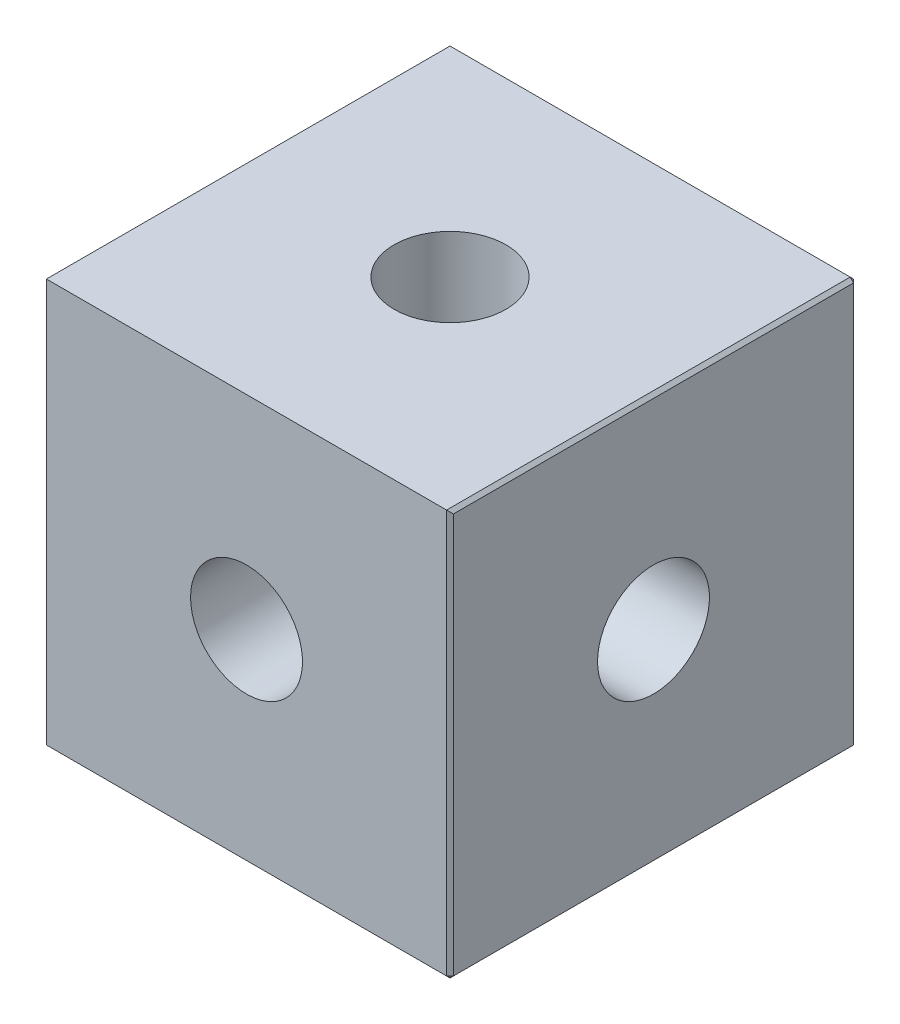
ISO-10303-21;
HEADER;
FILE_DESCRIPTION(('STEP AP214'),'2;1');
FILE_NAME('part.step','',(''),(''),'','','');
FILE_SCHEMA(('AUTOMOTIVE_DESIGN { 1 0 10303 214 1 1 1 1 }'));
ENDSEC;
DATA;
#1=APPLICATION_CONTEXT('core data for automotive mechanical design processes');
#2=APPLICATION_PROTOCOL_DEFINITION('international standard','automotive_design',2000,#1);
#3=PRODUCT_CONTEXT('',#1,'mechanical');
#4=PRODUCT('Part','Part','',(#3));
#5=PRODUCT_RELATED_PRODUCT_CATEGORY('part','',(#4));
#6=PRODUCT_DEFINITION_FORMATION('','',#4);
#7=PRODUCT_DEFINITION_CONTEXT('part definition',#1,'design');
#8=PRODUCT_DEFINITION('design','',#6,#7);
#9=PRODUCT_DEFINITION_SHAPE('','',#8);
#10=(LENGTH_UNIT() NAMED_UNIT(*) SI_UNIT(.MILLI.,.METRE.));
#11=(NAMED_UNIT(*) PLANE_ANGLE_UNIT() SI_UNIT($,.RADIAN.));
#12=(NAMED_UNIT(*) SI_UNIT($,.STERADIAN.) SOLID_ANGLE_UNIT());
#13=UNCERTAINTY_MEASURE_WITH_UNIT(LENGTH_MEASURE(1.E-05),#10,'distance_accuracy_value','');
#14=(GEOMETRIC_REPRESENTATION_CONTEXT(3) GLOBAL_UNCERTAINTY_ASSIGNED_CONTEXT((#13)) GLOBAL_UNIT_ASSIGNED_CONTEXT((#10,
#11,#12)) REPRESENTATION_CONTEXT('',''));
#15=CARTESIAN_POINT('',(0.,0.,0.));
#16=DIRECTION('',(0.,0.,1.));
#17=DIRECTION('',(1.,0.,0.));
#18=AXIS2_PLACEMENT_3D('',#15,#16,#17);
#19=CARTESIAN_POINT('',(-6.,12.,-6.));
#20=DIRECTION('',(0.,0.,1.));
#21=DIRECTION('',(1.,0.,0.));
#22=AXIS2_PLACEMENT_3D('',#19,#20,#21);
#23=PLANE('',#22);
#24=DIRECTION('',(0.,1.,0.));
#25=VECTOR('',#24,1.);
#26=CARTESIAN_POINT('',(-5.9,12.,-6.));
#27=LINE('',#26,#25);
#28=CARTESIAN_POINT('',(-5.9,0.0999999999999994,-6.));
#29=VERTEX_POINT('',#28);
#30=CARTESIAN_POINT('',(-5.9,11.9,-6.));
#31=VERTEX_POINT('',#30);
#32=EDGE_CURVE('E224',#29,#31,#27,.T.);
#33=ORIENTED_EDGE('',*,*,#32,.T.);
#34=DIRECTION('',(1.,0.,0.));
#35=VECTOR('',#34,1.);
#36=CARTESIAN_POINT('',(6.,11.9,-6.));
#37=LINE('',#36,#35);
#38=CARTESIAN_POINT('',(5.9,11.9,-6.));
#39=VERTEX_POINT('',#38);
#40=EDGE_CURVE('E230',#31,#39,#37,.T.);
#41=ORIENTED_EDGE('',*,*,#40,.T.);
#42=DIRECTION('',(0.,-1.,0.));
#43=VECTOR('',#42,1.);
#44=CARTESIAN_POINT('',(5.9,12.,-6.));
#45=LINE('',#44,#43);
#46=CARTESIAN_POINT('',(5.9,0.0999999999999994,-6.));
#47=VERTEX_POINT('',#46);
#48=EDGE_CURVE('E228',#39,#47,#45,.T.);
#49=ORIENTED_EDGE('',*,*,#48,.T.);
#50=DIRECTION('',(-1.,0.,0.));
#51=VECTOR('',#50,1.);
#52=CARTESIAN_POINT('',(-6.,0.0999999999999994,-6.));
#53=LINE('',#52,#51);
#54=EDGE_CURVE('E226',#47,#29,#53,.T.);
#55=ORIENTED_EDGE('',*,*,#54,.T.);
#56=EDGE_LOOP('',(#33,#41,#49,#55));
#57=FACE_BOUND('',#56,.T.);
#58=CARTESIAN_POINT('',(0.,6.,-6.));
#59=DIRECTION('',(0.,0.,-1.));
#60=DIRECTION('',(-1.,0.,0.));
#61=AXIS2_PLACEMENT_3D('',#58,#59,#60);
#62=CIRCLE('',#61,1.65);
#63=CARTESIAN_POINT('',(-1.65,6.,-6.));
#64=VERTEX_POINT('',#63);
#65=EDGE_CURVE('E327',#64,#64,#62,.T.);
#66=ORIENTED_EDGE('',*,*,#65,.F.);
#67=EDGE_LOOP('',(#66));
#68=FACE_BOUND('',#67,.T.);
#69=ADVANCED_FACE('F55',(#57,#68),#23,.F.);
#70=CARTESIAN_POINT('',(0.,12.,0.));
#71=DIRECTION('',(0.,1.,0.));
#72=DIRECTION('',(0.,0.,1.));
#73=AXIS2_PLACEMENT_3D('',#70,#71,#72);
#74=CYLINDRICAL_SURFACE('',#73,1.65);
#75=CARTESIAN_POINT('',(0.,12.,0.));
#76=DIRECTION('',(0.,1.,0.));
#77=DIRECTION('',(0.,0.,1.));
#78=AXIS2_PLACEMENT_3D('',#75,#76,#77);
#79=CIRCLE('',#78,1.65);
#80=CARTESIAN_POINT('',(0.,12.,1.65));
#81=VERTEX_POINT('',#80);
#82=EDGE_CURVE('E334',#81,#81,#79,.T.);
#83=ORIENTED_EDGE('',*,*,#82,.T.);
#84=EDGE_LOOP('',(#83));
#85=FACE_BOUND('',#84,.T.);
#86=CARTESIAN_POINT('',(0.,6.,0.));
#87=DIRECTION('',(0.,0.707106781186547,0.707106781186547));
#88=DIRECTION('',(0.,0.707106781186547,-0.707106781186547));
#89=AXIS2_PLACEMENT_3D('',#86,#87,#88);
#90=ELLIPSE('',#89,2.3334523779156,1.65);
#91=CARTESIAN_POINT('',(-1.1667261889578,7.1667261889578,-1.1667261889578));
#92=VERTEX_POINT('',#91);
#93=CARTESIAN_POINT('',(1.1667261889578,7.1667261889578,-1.1667261889578));
#94=VERTEX_POINT('',#93);
#95=EDGE_CURVE('E194',#92,#94,#90,.F.);
#96=ORIENTED_EDGE('',*,*,#95,.T.);
#97=CARTESIAN_POINT('',(0.,6.,0.));
#98=DIRECTION('',(-0.707106781186547,0.707106781186547,0.));
#99=DIRECTION('',(0.707106781186547,0.707106781186547,0.));
#100=AXIS2_PLACEMENT_3D('',#97,#98,#99);
#101=ELLIPSE('',#100,2.3334523779156,1.65);
#102=CARTESIAN_POINT('',(1.1667261889578,7.1667261889578,1.1667261889578));
#103=VERTEX_POINT('',#102);
#104=EDGE_CURVE('E316',#94,#103,#101,.F.);
#105=ORIENTED_EDGE('',*,*,#104,.T.);
#106=CARTESIAN_POINT('',(0.,6.,0.));
#107=DIRECTION('',(0.,0.707106781186547,-0.707106781186547));
#108=DIRECTION('',(0.,0.707106781186547,0.707106781186547));
#109=AXIS2_PLACEMENT_3D('',#106,#107,#108);
#110=ELLIPSE('',#109,2.3334523779156,1.65);
#111=CARTESIAN_POINT('',(-1.1667261889578,7.1667261889578,1.1667261889578));
#112=VERTEX_POINT('',#111);
#113=EDGE_CURVE('E178',#103,#112,#110,.F.);
#114=ORIENTED_EDGE('',*,*,#113,.T.);
#115=CARTESIAN_POINT('',(0.,6.,0.));
#116=DIRECTION('',(0.707106781186547,0.707106781186547,0.));
#117=DIRECTION('',(-0.707106781186547,0.707106781186547,0.));
#118=AXIS2_PLACEMENT_3D('',#115,#116,#117);
#119=ELLIPSE('',#118,2.3334523779156,1.65);
#120=EDGE_CURVE('E324',#112,#92,#119,.F.);
#121=ORIENTED_EDGE('',*,*,#120,.T.);
#122=EDGE_LOOP('',(#96,#105,#114,#121));
#123=FACE_BOUND('',#122,.T.);
#124=ADVANCED_FACE('F425',(#85,#123),#74,.F.);
#125=CARTESIAN_POINT('',(6.,12.,-6.));
#126=DIRECTION('',(-1.,0.,0.));
#127=DIRECTION('',(0.,0.,1.));
#128=AXIS2_PLACEMENT_3D('',#125,#126,#127);
#129=PLANE('',#128);
#130=DIRECTION('',(0.,1.,0.));
#131=VECTOR('',#130,1.);
#132=CARTESIAN_POINT('',(6.,12.,-5.9));
#133=LINE('',#132,#131);
#134=CARTESIAN_POINT('',(6.,0.100000000000001,-5.9));
#135=VERTEX_POINT('',#134);
#136=CARTESIAN_POINT('',(6.,11.9,-5.9));
#137=VERTEX_POINT('',#136);
#138=EDGE_CURVE('E219',#135,#137,#133,.T.);
#139=ORIENTED_EDGE('',*,*,#138,.T.);
#140=DIRECTION('',(0.,0.,1.));
#141=VECTOR('',#140,1.);
#142=CARTESIAN_POINT('',(6.,11.9,6.));
#143=LINE('',#142,#141);
#144=CARTESIAN_POINT('',(6.,11.9,5.9));
#145=VERTEX_POINT('',#144);
#146=EDGE_CURVE('E221',#137,#145,#143,.T.);
#147=ORIENTED_EDGE('',*,*,#146,.T.);
#148=DIRECTION('',(0.,-1.,0.));
#149=VECTOR('',#148,1.);
#150=CARTESIAN_POINT('',(6.,12.,5.9));
#151=LINE('',#150,#149);
#152=CARTESIAN_POINT('',(6.,0.100000000000001,5.9));
#153=VERTEX_POINT('',#152);
#154=EDGE_CURVE('E215',#145,#153,#151,.T.);
#155=ORIENTED_EDGE('',*,*,#154,.T.);
#156=DIRECTION('',(0.,0.,-1.));
#157=VECTOR('',#156,1.);
#158=CARTESIAN_POINT('',(6.,0.100000000000001,-6.));
#159=LINE('',#158,#157);
#160=EDGE_CURVE('E217',#153,#135,#159,.T.);
#161=ORIENTED_EDGE('',*,*,#160,.T.);
#162=EDGE_LOOP('',(#139,#147,#155,#161));
#163=FACE_BOUND('',#162,.T.);
#164=CARTESIAN_POINT('',(6.,6.,0.));
#165=DIRECTION('',(-1.,0.,0.));
#166=DIRECTION('',(0.,0.,1.));
#167=AXIS2_PLACEMENT_3D('',#164,#165,#166);
#168=CIRCLE('',#167,1.65);
#169=CARTESIAN_POINT('',(6.,6.,1.65));
#170=VERTEX_POINT('',#169);
#171=EDGE_CURVE('E187',#170,#170,#168,.T.);
#172=ORIENTED_EDGE('',*,*,#171,.T.);
#173=EDGE_LOOP('',(#172));
#174=FACE_BOUND('',#173,.T.);
#175=ADVANCED_FACE('F402',(#163,#174),#129,.F.);
#176=CARTESIAN_POINT('',(-6.,12.,-6.));
#177=DIRECTION('',(1.,0.,0.));
#178=DIRECTION('',(0.,0.,-1.));
#179=AXIS2_PLACEMENT_3D('',#176,#177,#178);
#180=PLANE('',#179);
#181=DIRECTION('',(0.,-1.,0.));
#182=VECTOR('',#181,1.);
#183=CARTESIAN_POINT('',(-6.,12.,-5.9));
#184=LINE('',#183,#182);
#185=CARTESIAN_POINT('',(-6.,11.9,-5.9));
#186=VERTEX_POINT('',#185);
#187=CARTESIAN_POINT('',(-6.,0.100000000000001,-5.9));
#188=VERTEX_POINT('',#187);
#189=EDGE_CURVE('E248',#186,#188,#184,.T.);
#190=ORIENTED_EDGE('',*,*,#189,.T.);
#191=DIRECTION('',(0.,0.,1.));
#192=VECTOR('',#191,1.);
#193=CARTESIAN_POINT('',(-6.,0.100000000000001,-6.));
#194=LINE('',#193,#192);
#195=CARTESIAN_POINT('',(-6.,0.100000000000001,5.9));
#196=VERTEX_POINT('',#195);
#197=EDGE_CURVE('E11',#188,#196,#194,.T.);
#198=ORIENTED_EDGE('',*,*,#197,.T.);
#199=DIRECTION('',(0.,1.,0.));
#200=VECTOR('',#199,1.);
#201=CARTESIAN_POINT('',(-6.,12.,5.9));
#202=LINE('',#201,#200);
#203=CARTESIAN_POINT('',(-6.,11.9,5.9));
#204=VERTEX_POINT('',#203);
#205=EDGE_CURVE('E65',#196,#204,#202,.T.);
#206=ORIENTED_EDGE('',*,*,#205,.T.);
#207=DIRECTION('',(0.,0.,-1.));
#208=VECTOR('',#207,1.);
#209=CARTESIAN_POINT('',(-6.,11.9,-6.));
#210=LINE('',#209,#208);
#211=EDGE_CURVE('E250',#204,#186,#210,.T.);
#212=ORIENTED_EDGE('',*,*,#211,.T.);
#213=EDGE_LOOP('',(#190,#198,#206,#212));
#214=FACE_BOUND('',#213,.T.);
#215=CARTESIAN_POINT('',(-6.,6.,0.));
#216=DIRECTION('',(-1.,0.,0.));
#217=DIRECTION('',(0.,0.,1.));
#218=AXIS2_PLACEMENT_3D('',#215,#216,#217);
#219=CIRCLE('',#218,1.65);
#220=CARTESIAN_POINT('',(-6.,6.,1.65));
#221=VERTEX_POINT('',#220);
#222=EDGE_CURVE('E302',#221,#221,#219,.T.);
#223=ORIENTED_EDGE('',*,*,#222,.F.);
#224=EDGE_LOOP('',(#223));
#225=FACE_BOUND('',#224,.T.);
#226=ADVANCED_FACE('F379',(#214,#225),#180,.F.);
#227=CARTESIAN_POINT('',(-6.,12.,6.));
#228=DIRECTION('',(0.,0.,-1.));
#229=DIRECTION('',(-1.,0.,0.));
#230=AXIS2_PLACEMENT_3D('',#227,#228,#229);
#231=PLANE('',#230);
#232=CARTESIAN_POINT('',(0.,6.,6.));
#233=DIRECTION('',(0.,0.,-1.));
#234=DIRECTION('',(-1.,0.,0.));
#235=AXIS2_PLACEMENT_3D('',#232,#233,#234);
#236=CIRCLE('',#235,1.65);
#237=CARTESIAN_POINT('',(-1.65,6.,6.));
#238=VERTEX_POINT('',#237);
#239=EDGE_CURVE('E331',#238,#238,#236,.T.);
#240=ORIENTED_EDGE('',*,*,#239,.T.);
#241=EDGE_LOOP('',(#240));
#242=FACE_BOUND('',#241,.T.);
#243=DIRECTION('',(1.,0.,0.));
#244=VECTOR('',#243,1.);
#245=CARTESIAN_POINT('',(-6.,0.100000000000001,6.));
#246=LINE('',#245,#244);
#247=CARTESIAN_POINT('',(-5.9,0.100000000000001,6.));
#248=VERTEX_POINT('',#247);
#249=CARTESIAN_POINT('',(5.9,0.100000000000001,6.));
#250=VERTEX_POINT('',#249);
#251=EDGE_CURVE('E244',#248,#250,#246,.T.);
#252=ORIENTED_EDGE('',*,*,#251,.T.);
#253=DIRECTION('',(0.,1.,0.));
#254=VECTOR('',#253,1.);
#255=CARTESIAN_POINT('',(5.9,12.,6.));
#256=LINE('',#255,#254);
#257=CARTESIAN_POINT('',(5.9,12.,6.));
#258=VERTEX_POINT('',#257);
#259=EDGE_CURVE('E246',#250,#258,#256,.T.);
#260=ORIENTED_EDGE('',*,*,#259,.T.);
#261=DIRECTION('',(1.,0.,0.));
#262=VECTOR('',#261,1.);
#263=CARTESIAN_POINT('',(-6.,12.,6.));
#264=LINE('',#263,#262);
#265=CARTESIAN_POINT('',(-5.9,12.,6.));
#266=VERTEX_POINT('',#265);
#267=EDGE_CURVE('E202',#266,#258,#264,.T.);
#268=ORIENTED_EDGE('',*,*,#267,.F.);
#269=DIRECTION('',(0.,-1.,0.));
#270=VECTOR('',#269,1.);
#271=CARTESIAN_POINT('',(-5.9,12.,6.));
#272=LINE('',#271,#270);
#273=EDGE_CURVE('E242',#266,#248,#272,.T.);
#274=ORIENTED_EDGE('',*,*,#273,.T.);
#275=EDGE_LOOP('',(#252,#260,#268,#274));
#276=FACE_BOUND('',#275,.T.);
#277=ADVANCED_FACE('F385',(#242,#276),#231,.F.);
#278=CARTESIAN_POINT('',(0.,12.,0.));
#279=DIRECTION('',(0.,1.,0.));
#280=DIRECTION('',(0.,0.,1.));
#281=AXIS2_PLACEMENT_3D('',#278,#279,#280);
#282=PLANE('',#281);
#283=ORIENTED_EDGE('',*,*,#82,.F.);
#284=EDGE_LOOP('',(#283));
#285=FACE_BOUND('',#284,.T.);
#286=ORIENTED_EDGE('',*,*,#267,.T.);
#287=DIRECTION('',(0.,0.,-1.));
#288=VECTOR('',#287,1.);
#289=CARTESIAN_POINT('',(5.9,12.,-6.));
#290=LINE('',#289,#288);
#291=CARTESIAN_POINT('',(5.9,12.,-5.9));
#292=VERTEX_POINT('',#291);
#293=EDGE_CURVE('E212',#258,#292,#290,.T.);
#294=ORIENTED_EDGE('',*,*,#293,.T.);
#295=DIRECTION('',(-1.,0.,0.));
#296=VECTOR('',#295,1.);
#297=CARTESIAN_POINT('',(-6.,12.,-5.9));
#298=LINE('',#297,#296);
#299=CARTESIAN_POINT('',(-5.9,12.,-5.9));
#300=VERTEX_POINT('',#299);
#301=EDGE_CURVE('E210',#292,#300,#298,.T.);
#302=ORIENTED_EDGE('',*,*,#301,.T.);
#303=DIRECTION('',(0.,0.,1.));
#304=VECTOR('',#303,1.);
#305=CARTESIAN_POINT('',(-5.9,12.,6.));
#306=LINE('',#305,#304);
#307=EDGE_CURVE('E208',#300,#266,#306,.T.);
#308=ORIENTED_EDGE('',*,*,#307,.T.);
#309=EDGE_LOOP('',(#286,#294,#302,#308));
#310=FACE_BOUND('',#309,.T.);
#311=ADVANCED_FACE('F344',(#285,#310),#282,.T.);
#312=CARTESIAN_POINT('',(0.,0.,0.));
#313=DIRECTION('',(0.,1.,0.));
#314=DIRECTION('',(0.,0.,1.));
#315=AXIS2_PLACEMENT_3D('',#312,#313,#314);
#316=PLANE('',#315);
#317=DIRECTION('',(0.,0.,-1.));
#318=VECTOR('',#317,1.);
#319=CARTESIAN_POINT('',(-5.9,0.,0.));
#320=LINE('',#319,#318);
#321=CARTESIAN_POINT('',(-5.9,0.,5.9));
#322=VERTEX_POINT('',#321);
#323=CARTESIAN_POINT('',(-5.9,0.,-5.9));
#324=VERTEX_POINT('',#323);
#325=EDGE_CURVE('E233',#322,#324,#320,.T.);
#326=ORIENTED_EDGE('',*,*,#325,.T.);
#327=DIRECTION('',(1.,0.,0.));
#328=VECTOR('',#327,1.);
#329=CARTESIAN_POINT('',(0.,0.,-5.9));
#330=LINE('',#329,#328);
#331=CARTESIAN_POINT('',(5.9,0.,-5.9));
#332=VERTEX_POINT('',#331);
#333=EDGE_CURVE('E239',#324,#332,#330,.T.);
#334=ORIENTED_EDGE('',*,*,#333,.T.);
#335=DIRECTION('',(0.,0.,1.));
#336=VECTOR('',#335,1.);
#337=CARTESIAN_POINT('',(5.9,0.,0.));
#338=LINE('',#337,#336);
#339=CARTESIAN_POINT('',(5.9,0.,5.9));
#340=VERTEX_POINT('',#339);
#341=EDGE_CURVE('E237',#332,#340,#338,.T.);
#342=ORIENTED_EDGE('',*,*,#341,.T.);
#343=DIRECTION('',(-1.,0.,0.));
#344=VECTOR('',#343,1.);
#345=CARTESIAN_POINT('',(0.,0.,5.9));
#346=LINE('',#345,#344);
#347=EDGE_CURVE('E235',#340,#322,#346,.T.);
#348=ORIENTED_EDGE('',*,*,#347,.T.);
#349=EDGE_LOOP('',(#326,#334,#342,#348));
#350=FACE_BOUND('',#349,.T.);
#351=CARTESIAN_POINT('',(0.,0.,0.));
#352=DIRECTION('',(0.,1.,0.));
#353=DIRECTION('',(0.,0.,1.));
#354=AXIS2_PLACEMENT_3D('',#351,#352,#353);
#355=CIRCLE('',#354,1.65);
#356=CARTESIAN_POINT('',(0.,0.,1.65));
#357=VERTEX_POINT('',#356);
#358=EDGE_CURVE('E337',#357,#357,#355,.T.);
#359=ORIENTED_EDGE('',*,*,#358,.T.);
#360=EDGE_LOOP('',(#359));
#361=FACE_BOUND('',#360,.T.);
#362=ADVANCED_FACE('F692',(#350,#361),#316,.F.);
#363=CARTESIAN_POINT('',(0.,6.,0.));
#364=DIRECTION('',(0.,0.707106781186547,-0.707106781186547));
#365=DIRECTION('',(0.,0.707106781186547,0.707106781186547));
#366=AXIS2_PLACEMENT_3D('',#363,#364,#365);
#367=ELLIPSE('',#366,2.3334523779156,1.65);
#368=CARTESIAN_POINT('',(1.1667261889578,4.8332738110422,-1.1667261889578));
#369=VERTEX_POINT('',#368);
#370=CARTESIAN_POINT('',(-1.1667261889578,4.8332738110422,-1.1667261889578));
#371=VERTEX_POINT('',#370);
#372=EDGE_CURVE('E193',#369,#371,#367,.T.);
#373=ORIENTED_EDGE('',*,*,#372,.T.);
#374=CARTESIAN_POINT('',(0.,6.,0.));
#375=DIRECTION('',(-0.707106781186547,0.707106781186547,0.));
#376=DIRECTION('',(0.707106781186547,0.707106781186547,0.));
#377=AXIS2_PLACEMENT_3D('',#374,#375,#376);
#378=ELLIPSE('',#377,2.3334523779156,1.65);
#379=CARTESIAN_POINT('',(-1.1667261889578,4.8332738110422,1.1667261889578));
#380=VERTEX_POINT('',#379);
#381=EDGE_CURVE('E177',#371,#380,#378,.T.);
#382=ORIENTED_EDGE('',*,*,#381,.T.);
#383=CARTESIAN_POINT('',(0.,6.,0.));
#384=DIRECTION('',(0.,0.707106781186547,0.707106781186547));
#385=DIRECTION('',(0.,0.707106781186547,-0.707106781186547));
#386=AXIS2_PLACEMENT_3D('',#383,#384,#385);
#387=ELLIPSE('',#386,2.3334523779156,1.65);
#388=CARTESIAN_POINT('',(1.1667261889578,4.8332738110422,1.1667261889578));
#389=VERTEX_POINT('',#388);
#390=EDGE_CURVE('E185',#380,#389,#387,.T.);
#391=ORIENTED_EDGE('',*,*,#390,.T.);
#392=CARTESIAN_POINT('',(0.,6.,0.));
#393=DIRECTION('',(0.707106781186547,0.707106781186547,0.));
#394=DIRECTION('',(-0.707106781186547,0.707106781186547,0.));
#395=AXIS2_PLACEMENT_3D('',#392,#393,#394);
#396=ELLIPSE('',#395,2.3334523779156,1.65);
#397=EDGE_CURVE('E165',#389,#369,#396,.T.);
#398=ORIENTED_EDGE('',*,*,#397,.T.);
#399=EDGE_LOOP('',(#373,#382,#391,#398));
#400=FACE_BOUND('',#399,.T.);
#401=ORIENTED_EDGE('',*,*,#358,.F.);
#402=EDGE_LOOP('',(#401));
#403=FACE_BOUND('',#402,.T.);
#404=ADVANCED_FACE('F190',(#400,#403),#74,.F.);
#405=CARTESIAN_POINT('',(0.,6.,-6.));
#406=DIRECTION('',(0.,0.,-1.));
#407=DIRECTION('',(-1.,0.,0.));
#408=AXIS2_PLACEMENT_3D('',#405,#406,#407);
#409=CYLINDRICAL_SURFACE('',#408,1.65);
#410=ORIENTED_EDGE('',*,*,#65,.T.);
#411=EDGE_LOOP('',(#410));
#412=FACE_BOUND('',#411,.T.);
#413=ORIENTED_EDGE('',*,*,#372,.F.);
#414=CARTESIAN_POINT('',(0.,6.,0.));
#415=DIRECTION('',(-0.707106781186548,0.,-0.707106781186547));
#416=DIRECTION('',(0.707106781186547,0.,-0.707106781186548));
#417=AXIS2_PLACEMENT_3D('',#414,#415,#416);
#418=ELLIPSE('',#417,2.3334523779156,1.65);
#419=EDGE_CURVE('E171',#369,#94,#418,.F.);
#420=ORIENTED_EDGE('',*,*,#419,.T.);
#421=ORIENTED_EDGE('',*,*,#95,.F.);
#422=CARTESIAN_POINT('',(0.,6.,0.));
#423=DIRECTION('',(0.707106781186547,0.,-0.707106781186548));
#424=DIRECTION('',(-0.707106781186548,0.,-0.707106781186547));
#425=AXIS2_PLACEMENT_3D('',#422,#423,#424);
#426=ELLIPSE('',#425,2.3334523779156,1.65);
#427=EDGE_CURVE('E320',#92,#371,#426,.F.);
#428=ORIENTED_EDGE('',*,*,#427,.T.);
#429=EDGE_LOOP('',(#413,#420,#421,#428));
#430=FACE_BOUND('',#429,.T.);
#431=ADVANCED_FACE('F658',(#412,#430),#409,.F.);
#432=ORIENTED_EDGE('',*,*,#239,.F.);
#433=EDGE_LOOP('',(#432));
#434=FACE_BOUND('',#433,.T.);
#435=ORIENTED_EDGE('',*,*,#390,.F.);
#436=CARTESIAN_POINT('',(0.,6.,0.));
#437=DIRECTION('',(-0.707106781186548,0.,-0.707106781186547));
#438=DIRECTION('',(0.707106781186547,0.,-0.707106781186548));
#439=AXIS2_PLACEMENT_3D('',#436,#437,#438);
#440=ELLIPSE('',#439,2.3334523779156,1.65);
#441=EDGE_CURVE('E318',#380,#112,#440,.T.);
#442=ORIENTED_EDGE('',*,*,#441,.T.);
#443=ORIENTED_EDGE('',*,*,#113,.F.);
#444=CARTESIAN_POINT('',(0.,6.,0.));
#445=DIRECTION('',(0.707106781186547,0.,-0.707106781186548));
#446=DIRECTION('',(-0.707106781186548,0.,-0.707106781186547));
#447=AXIS2_PLACEMENT_3D('',#444,#445,#446);
#448=ELLIPSE('',#447,2.3334523779156,1.65);
#449=EDGE_CURVE('E168',#103,#389,#448,.T.);
#450=ORIENTED_EDGE('',*,*,#449,.T.);
#451=EDGE_LOOP('',(#435,#442,#443,#450));
#452=FACE_BOUND('',#451,.T.);
#453=ADVANCED_FACE('F183',(#434,#452),#409,.F.);
#454=CARTESIAN_POINT('',(-6.,6.,0.));
#455=DIRECTION('',(-1.,0.,0.));
#456=DIRECTION('',(0.,0.,1.));
#457=AXIS2_PLACEMENT_3D('',#454,#455,#456);
#458=CYLINDRICAL_SURFACE('',#457,1.65);
#459=ORIENTED_EDGE('',*,*,#171,.F.);
#460=EDGE_LOOP('',(#459));
#461=FACE_BOUND('',#460,.T.);
#462=ORIENTED_EDGE('',*,*,#419,.F.);
#463=ORIENTED_EDGE('',*,*,#397,.F.);
#464=ORIENTED_EDGE('',*,*,#449,.F.);
#465=ORIENTED_EDGE('',*,*,#104,.F.);
#466=EDGE_LOOP('',(#462,#463,#464,#465));
#467=FACE_BOUND('',#466,.T.);
#468=ADVANCED_FACE('F167',(#461,#467),#458,.F.);
#469=ORIENTED_EDGE('',*,*,#222,.T.);
#470=EDGE_LOOP('',(#469));
#471=FACE_BOUND('',#470,.T.);
#472=ORIENTED_EDGE('',*,*,#441,.F.);
#473=ORIENTED_EDGE('',*,*,#381,.F.);
#474=ORIENTED_EDGE('',*,*,#427,.F.);
#475=ORIENTED_EDGE('',*,*,#120,.F.);
#476=EDGE_LOOP('',(#472,#473,#474,#475));
#477=FACE_BOUND('',#476,.T.);
#478=ADVANCED_FACE('F634',(#471,#477),#458,.F.);
#479=CARTESIAN_POINT('',(-6.,0.100000000000001,-6.));
#480=DIRECTION('',(0.707106781186554,0.707106781186541,0.));
#481=DIRECTION('',(0.,0.,1.));
#482=AXIS2_PLACEMENT_3D('',#479,#480,#481);
#483=PLANE('',#482);
#484=DIRECTION('',(-0.707106781186541,0.707106781186554,0.));
#485=VECTOR('',#484,1.);
#486=CARTESIAN_POINT('',(-5.9,0.,5.9));
#487=LINE('',#486,#485);
#488=EDGE_CURVE('E300',#196,#322,#487,.F.);
#489=ORIENTED_EDGE('',*,*,#488,.F.);
#490=ORIENTED_EDGE('',*,*,#197,.F.);
#491=DIRECTION('',(0.707106781186541,-0.707106781186554,0.));
#492=VECTOR('',#491,1.);
#493=CARTESIAN_POINT('',(-5.95,0.0500000000000006,-5.9));
#494=LINE('',#493,#492);
#495=EDGE_CURVE('E60',#324,#188,#494,.F.);
#496=ORIENTED_EDGE('',*,*,#495,.F.);
#497=ORIENTED_EDGE('',*,*,#325,.F.);
#498=EDGE_LOOP('',(#489,#490,#496,#497));
#499=FACE_BOUND('',#498,.T.);
#500=ADVANCED_FACE('F58',(#499),#483,.F.);
#501=CARTESIAN_POINT('',(-5.9,12.,6.));
#502=DIRECTION('',(0.707106781186554,0.,-0.707106781186541));
#503=DIRECTION('',(0.,-1.,0.));
#504=AXIS2_PLACEMENT_3D('',#501,#502,#503);
#505=PLANE('',#504);
#506=DIRECTION('',(-0.577350269189619,-0.577350269189629,-0.577350269189629));
#507=VECTOR('',#506,1.);
#508=CARTESIAN_POINT('',(-7.89999999999999,9.99999999999998,3.99999999999998));
#509=LINE('',#508,#507);
#510=EDGE_CURVE('E297',#204,#266,#509,.F.);
#511=ORIENTED_EDGE('',*,*,#510,.F.);
#512=ORIENTED_EDGE('',*,*,#205,.F.);
#513=DIRECTION('',(0.707106781186541,0.,0.707106781186554));
#514=VECTOR('',#513,1.);
#515=CARTESIAN_POINT('',(-5.95,0.100000000000001,5.95));
#516=LINE('',#515,#514);
#517=EDGE_CURVE('E73',#248,#196,#516,.F.);
#518=ORIENTED_EDGE('',*,*,#517,.F.);
#519=ORIENTED_EDGE('',*,*,#273,.F.);
#520=EDGE_LOOP('',(#511,#512,#518,#519));
#521=FACE_BOUND('',#520,.T.);
#522=ADVANCED_FACE('F384',(#521),#505,.F.);
#523=CARTESIAN_POINT('',(-5.9,0.0999999999999994,-6.));
#524=DIRECTION('',(-0.577350269189636,-0.577350269189626,-0.577350269189616));
#525=DIRECTION('',(0.707106781186541,-0.707106781186554,0.));
#526=AXIS2_PLACEMENT_3D('',#523,#524,#525);
#527=PLANE('',#526);
#528=DIRECTION('',(0.,0.707106781186541,-0.707106781186554));
#529=VECTOR('',#528,1.);
#530=CARTESIAN_POINT('',(-5.9,0.0999999999999994,-6.));
#531=LINE('',#530,#529);
#532=EDGE_CURVE('E291',#324,#29,#531,.T.);
#533=ORIENTED_EDGE('',*,*,#532,.F.);
#534=ORIENTED_EDGE('',*,*,#495,.T.);
#535=DIRECTION('',(-0.707106781186541,0.,0.707106781186554));
#536=VECTOR('',#535,1.);
#537=CARTESIAN_POINT('',(-5.9,0.0999999999999994,-6.));
#538=LINE('',#537,#536);
#539=EDGE_CURVE('E294',#29,#188,#538,.T.);
#540=ORIENTED_EDGE('',*,*,#539,.F.);
#541=EDGE_LOOP('',(#533,#534,#540));
#542=FACE_BOUND('',#541,.T.);
#543=ADVANCED_FACE('F414',(#542),#527,.T.);
#544=CARTESIAN_POINT('',(-5.9,0.,5.9));
#545=DIRECTION('',(-0.577350269189636,-0.577350269189616,0.577350269189626));
#546=DIRECTION('',(0.707106781186541,0.,0.707106781186554));
#547=AXIS2_PLACEMENT_3D('',#544,#545,#546);
#548=PLANE('',#547);
#549=ORIENTED_EDGE('',*,*,#517,.T.);
#550=ORIENTED_EDGE('',*,*,#488,.T.);
#551=DIRECTION('',(0.,-0.707106781186554,-0.707106781186541));
#552=VECTOR('',#551,1.);
#553=CARTESIAN_POINT('',(-5.9,0.,5.9));
#554=LINE('',#553,#552);
#555=EDGE_CURVE('E288',#248,#322,#554,.T.);
#556=ORIENTED_EDGE('',*,*,#555,.F.);
#557=EDGE_LOOP('',(#549,#550,#556));
#558=FACE_BOUND('',#557,.T.);
#559=ADVANCED_FACE('F416',(#558),#548,.T.);
#560=CARTESIAN_POINT('',(-5.9,12.,0.));
#561=DIRECTION('',(-0.707106781186554,0.707106781186541,0.));
#562=DIRECTION('',(0.,0.,-1.));
#563=AXIS2_PLACEMENT_3D('',#560,#561,#562);
#564=PLANE('',#563);
#565=ORIENTED_EDGE('',*,*,#510,.T.);
#566=ORIENTED_EDGE('',*,*,#307,.F.);
#567=DIRECTION('',(0.707106781186541,0.707106781186554,0.));
#568=VECTOR('',#567,1.);
#569=CARTESIAN_POINT('',(-5.9,12.,-5.9));
#570=LINE('',#569,#568);
#571=EDGE_CURVE('E285',#186,#300,#570,.T.);
#572=ORIENTED_EDGE('',*,*,#571,.F.);
#573=ORIENTED_EDGE('',*,*,#211,.F.);
#574=EDGE_LOOP('',(#565,#566,#572,#573));
#575=FACE_BOUND('',#574,.T.);
#576=ADVANCED_FACE('F369',(#575),#564,.T.);
#577=CARTESIAN_POINT('',(-6.,12.,-5.9));
#578=DIRECTION('',(0.707106781186554,0.,0.707106781186541));
#579=DIRECTION('',(0.,-1.,0.));
#580=AXIS2_PLACEMENT_3D('',#577,#578,#579);
#581=PLANE('',#580);
#582=ORIENTED_EDGE('',*,*,#539,.T.);
#583=ORIENTED_EDGE('',*,*,#189,.F.);
#584=DIRECTION('',(0.707106781186541,0.,-0.707106781186554));
#585=VECTOR('',#584,1.);
#586=CARTESIAN_POINT('',(-5.95,11.9,-5.95));
#587=LINE('',#586,#585);
#588=EDGE_CURVE('E282',#31,#186,#587,.F.);
#589=ORIENTED_EDGE('',*,*,#588,.F.);
#590=ORIENTED_EDGE('',*,*,#32,.F.);
#591=EDGE_LOOP('',(#582,#583,#589,#590));
#592=FACE_BOUND('',#591,.T.);
#593=ADVANCED_FACE('F377',(#592),#581,.F.);
#594=CARTESIAN_POINT('',(-6.,0.0999999999999994,-6.));
#595=DIRECTION('',(0.,0.707106781186554,0.707106781186541));
#596=DIRECTION('',(-1.,0.,0.));
#597=AXIS2_PLACEMENT_3D('',#594,#595,#596);
#598=PLANE('',#597);
#599=ORIENTED_EDGE('',*,*,#532,.T.);
#600=ORIENTED_EDGE('',*,*,#54,.F.);
#601=DIRECTION('',(0.,-0.707106781186541,0.707106781186554));
#602=VECTOR('',#601,1.);
#603=CARTESIAN_POINT('',(5.9,0.0999999999999994,-6.));
#604=LINE('',#603,#602);
#605=EDGE_CURVE('E279',#332,#47,#604,.F.);
#606=ORIENTED_EDGE('',*,*,#605,.F.);
#607=ORIENTED_EDGE('',*,*,#333,.F.);
#608=EDGE_LOOP('',(#599,#600,#606,#607));
#609=FACE_BOUND('',#608,.T.);
#610=ADVANCED_FACE('F413',(#609),#598,.F.);
#611=CARTESIAN_POINT('',(6.,0.100000000000001,-6.));
#612=DIRECTION('',(-0.707106781186554,0.707106781186541,0.));
#613=DIRECTION('',(0.,0.,-1.));
#614=AXIS2_PLACEMENT_3D('',#611,#612,#613);
#615=PLANE('',#614);
#616=DIRECTION('',(-0.707106781186541,-0.707106781186554,0.));
#617=VECTOR('',#616,1.);
#618=CARTESIAN_POINT('',(5.9,0.,5.9));
#619=LINE('',#618,#617);
#620=EDGE_CURVE('E274',#340,#153,#619,.F.);
#621=ORIENTED_EDGE('',*,*,#620,.F.);
#622=ORIENTED_EDGE('',*,*,#341,.F.);
#623=DIRECTION('',(0.707106781186541,0.707106781186554,0.));
#624=VECTOR('',#623,1.);
#625=CARTESIAN_POINT('',(5.95,0.0500000000000005,-5.9));
#626=LINE('',#625,#624);
#627=EDGE_CURVE('E277',#135,#332,#626,.F.);
#628=ORIENTED_EDGE('',*,*,#627,.F.);
#629=ORIENTED_EDGE('',*,*,#160,.F.);
#630=EDGE_LOOP('',(#621,#622,#628,#629));
#631=FACE_BOUND('',#630,.T.);
#632=ADVANCED_FACE('F398',(#631),#615,.F.);
#633=CARTESIAN_POINT('',(-6.,0.100000000000001,6.));
#634=DIRECTION('',(0.,0.707106781186541,-0.707106781186554));
#635=DIRECTION('',(1.,0.,0.));
#636=AXIS2_PLACEMENT_3D('',#633,#634,#635);
#637=PLANE('',#636);
#638=ORIENTED_EDGE('',*,*,#555,.T.);
#639=ORIENTED_EDGE('',*,*,#347,.F.);
#640=DIRECTION('',(0.,0.707106781186554,0.707106781186541));
#641=VECTOR('',#640,1.);
#642=CARTESIAN_POINT('',(5.9,0.,5.9));
#643=LINE('',#642,#641);
#644=EDGE_CURVE('E271',#250,#340,#643,.F.);
#645=ORIENTED_EDGE('',*,*,#644,.F.);
#646=ORIENTED_EDGE('',*,*,#251,.F.);
#647=EDGE_LOOP('',(#638,#639,#645,#646));
#648=FACE_BOUND('',#647,.T.);
#649=ADVANCED_FACE('F391',(#648),#637,.F.);
#650=CARTESIAN_POINT('',(-5.9,12.,-5.9));
#651=DIRECTION('',(-0.577350269189636,0.577350269189626,-0.577350269189616));
#652=DIRECTION('',(-0.707106781186541,-0.707106781186554,0.));
#653=AXIS2_PLACEMENT_3D('',#650,#651,#652);
#654=PLANE('',#653);
#655=ORIENTED_EDGE('',*,*,#588,.T.);
#656=ORIENTED_EDGE('',*,*,#571,.T.);
#657=DIRECTION('',(0.,-0.707106781186541,-0.707106781186554));
#658=VECTOR('',#657,1.);
#659=CARTESIAN_POINT('',(-5.9,12.,-5.9));
#660=LINE('',#659,#658);
#661=EDGE_CURVE('E268',#31,#300,#660,.F.);
#662=ORIENTED_EDGE('',*,*,#661,.F.);
#663=EDGE_LOOP('',(#655,#656,#662));
#664=FACE_BOUND('',#663,.T.);
#665=ADVANCED_FACE('F372',(#664),#654,.T.);
#666=CARTESIAN_POINT('',(5.9,0.0999999999999994,-6.));
#667=DIRECTION('',(0.577350269189636,-0.577350269189626,-0.577350269189616));
#668=DIRECTION('',(0.707106781186541,0.707106781186554,0.));
#669=AXIS2_PLACEMENT_3D('',#666,#667,#668);
#670=PLANE('',#669);
#671=ORIENTED_EDGE('',*,*,#627,.T.);
#672=ORIENTED_EDGE('',*,*,#605,.T.);
#673=DIRECTION('',(-0.707106781186541,0.,-0.707106781186554));
#674=VECTOR('',#673,1.);
#675=CARTESIAN_POINT('',(5.9,0.0999999999999994,-6.));
#676=LINE('',#675,#674);
#677=EDGE_CURVE('E265',#135,#47,#676,.T.);
#678=ORIENTED_EDGE('',*,*,#677,.F.);
#679=EDGE_LOOP('',(#671,#672,#678));
#680=FACE_BOUND('',#679,.T.);
#681=ADVANCED_FACE('F469',(#680),#670,.T.);
#682=CARTESIAN_POINT('',(5.9,0.,5.9));
#683=DIRECTION('',(0.577350269189636,-0.577350269189616,0.577350269189626));
#684=DIRECTION('',(0.707106781186541,0.,-0.707106781186554));
#685=AXIS2_PLACEMENT_3D('',#682,#683,#684);
#686=PLANE('',#685);
#687=ORIENTED_EDGE('',*,*,#644,.T.);
#688=ORIENTED_EDGE('',*,*,#620,.T.);
#689=DIRECTION('',(0.707106781186541,0.,-0.707106781186554));
#690=VECTOR('',#689,1.);
#691=CARTESIAN_POINT('',(5.95,0.100000000000001,5.95));
#692=LINE('',#691,#690);
#693=EDGE_CURVE('E262',#250,#153,#692,.T.);
#694=ORIENTED_EDGE('',*,*,#693,.F.);
#695=EDGE_LOOP('',(#687,#688,#694));
#696=FACE_BOUND('',#695,.T.);
#697=ADVANCED_FACE('F394',(#696),#686,.T.);
#698=CARTESIAN_POINT('',(0.,12.,-5.9));
#699=DIRECTION('',(0.,0.707106781186554,-0.707106781186541));
#700=DIRECTION('',(1.,0.,0.));
#701=AXIS2_PLACEMENT_3D('',#698,#699,#700);
#702=PLANE('',#701);
#703=ORIENTED_EDGE('',*,*,#661,.T.);
#704=ORIENTED_EDGE('',*,*,#301,.F.);
#705=DIRECTION('',(0.,0.707106781186541,0.707106781186554));
#706=VECTOR('',#705,1.);
#707=CARTESIAN_POINT('',(5.9,12.,-5.9));
#708=LINE('',#707,#706);
#709=EDGE_CURVE('E259',#39,#292,#708,.T.);
#710=ORIENTED_EDGE('',*,*,#709,.F.);
#711=ORIENTED_EDGE('',*,*,#40,.F.);
#712=EDGE_LOOP('',(#703,#704,#710,#711));
#713=FACE_BOUND('',#712,.T.);
#714=ADVANCED_FACE('F365',(#713),#702,.T.);
#715=CARTESIAN_POINT('',(5.9,12.,-6.));
#716=DIRECTION('',(-0.707106781186554,0.,0.707106781186541));
#717=DIRECTION('',(0.,-1.,0.));
#718=AXIS2_PLACEMENT_3D('',#715,#716,#717);
#719=PLANE('',#718);
#720=ORIENTED_EDGE('',*,*,#677,.T.);
#721=ORIENTED_EDGE('',*,*,#48,.F.);
#722=DIRECTION('',(0.707106781186541,0.,0.707106781186554));
#723=VECTOR('',#722,1.);
#724=CARTESIAN_POINT('',(5.95,11.9,-5.95));
#725=LINE('',#724,#723);
#726=EDGE_CURVE('E257',#137,#39,#725,.F.);
#727=ORIENTED_EDGE('',*,*,#726,.F.);
#728=ORIENTED_EDGE('',*,*,#138,.F.);
#729=EDGE_LOOP('',(#720,#721,#727,#728));
#730=FACE_BOUND('',#729,.T.);
#731=ADVANCED_FACE('F406',(#730),#719,.F.);
#732=CARTESIAN_POINT('',(6.,12.,5.9));
#733=DIRECTION('',(-0.707106781186554,0.,-0.707106781186541));
#734=DIRECTION('',(0.,-1.,0.));
#735=AXIS2_PLACEMENT_3D('',#732,#733,#734);
#736=PLANE('',#735);
#737=ORIENTED_EDGE('',*,*,#693,.T.);
#738=ORIENTED_EDGE('',*,*,#154,.F.);
#739=DIRECTION('',(0.577350269189626,-0.577350269189616,-0.577350269189636));
#740=VECTOR('',#739,1.);
#741=CARTESIAN_POINT('',(5.96666666666667,11.9333333333333,5.93333333333333));
#742=LINE('',#741,#740);
#743=EDGE_CURVE('E255',#258,#145,#742,.T.);
#744=ORIENTED_EDGE('',*,*,#743,.F.);
#745=ORIENTED_EDGE('',*,*,#259,.F.);
#746=EDGE_LOOP('',(#737,#738,#744,#745));
#747=FACE_BOUND('',#746,.T.);
#748=ADVANCED_FACE('F352',(#747),#736,.F.);
#749=CARTESIAN_POINT('',(5.9,12.,-5.9));
#750=DIRECTION('',(0.577350269189626,0.577350269189636,-0.577350269189616));
#751=DIRECTION('',(-0.707106781186554,0.707106781186541,0.));
#752=AXIS2_PLACEMENT_3D('',#749,#750,#751);
#753=PLANE('',#752);
#754=ORIENTED_EDGE('',*,*,#726,.T.);
#755=ORIENTED_EDGE('',*,*,#709,.T.);
#756=DIRECTION('',(0.707106781186554,-0.707106781186541,0.));
#757=VECTOR('',#756,1.);
#758=CARTESIAN_POINT('',(5.9,12.,-5.9));
#759=LINE('',#758,#757);
#760=EDGE_CURVE('E253',#137,#292,#759,.F.);
#761=ORIENTED_EDGE('',*,*,#760,.F.);
#762=EDGE_LOOP('',(#754,#755,#761));
#763=FACE_BOUND('',#762,.T.);
#764=ADVANCED_FACE('F360',(#763),#753,.T.);
#765=CARTESIAN_POINT('',(5.9,12.,0.));
#766=DIRECTION('',(0.707106781186541,0.707106781186554,0.));
#767=DIRECTION('',(0.,0.,1.));
#768=AXIS2_PLACEMENT_3D('',#765,#766,#767);
#769=PLANE('',#768);
#770=ORIENTED_EDGE('',*,*,#743,.T.);
#771=ORIENTED_EDGE('',*,*,#146,.F.);
#772=ORIENTED_EDGE('',*,*,#760,.T.);
#773=ORIENTED_EDGE('',*,*,#293,.F.);
#774=EDGE_LOOP('',(#770,#771,#772,#773));
#775=FACE_BOUND('',#774,.T.);
#776=ADVANCED_FACE('F355',(#775),#769,.T.);
#777=CLOSED_SHELL('',(#69,#124,#175,#226,#277,#311,#362,#404,#431,#453,#468,#478,#500,#522,#543,
#559,#576,#593,#610,#632,#649,#665,#681,#697,#714,#731,#748,#764,#776));
#778=MANIFOLD_SOLID_BREP('B2',#777);
#779=ADVANCED_BREP_SHAPE_REPRESENTATION('',(#18,#778),#14);
#780=SHAPE_DEFINITION_REPRESENTATION(#9,#779);
ENDSEC;
END-ISO-10303-21;
